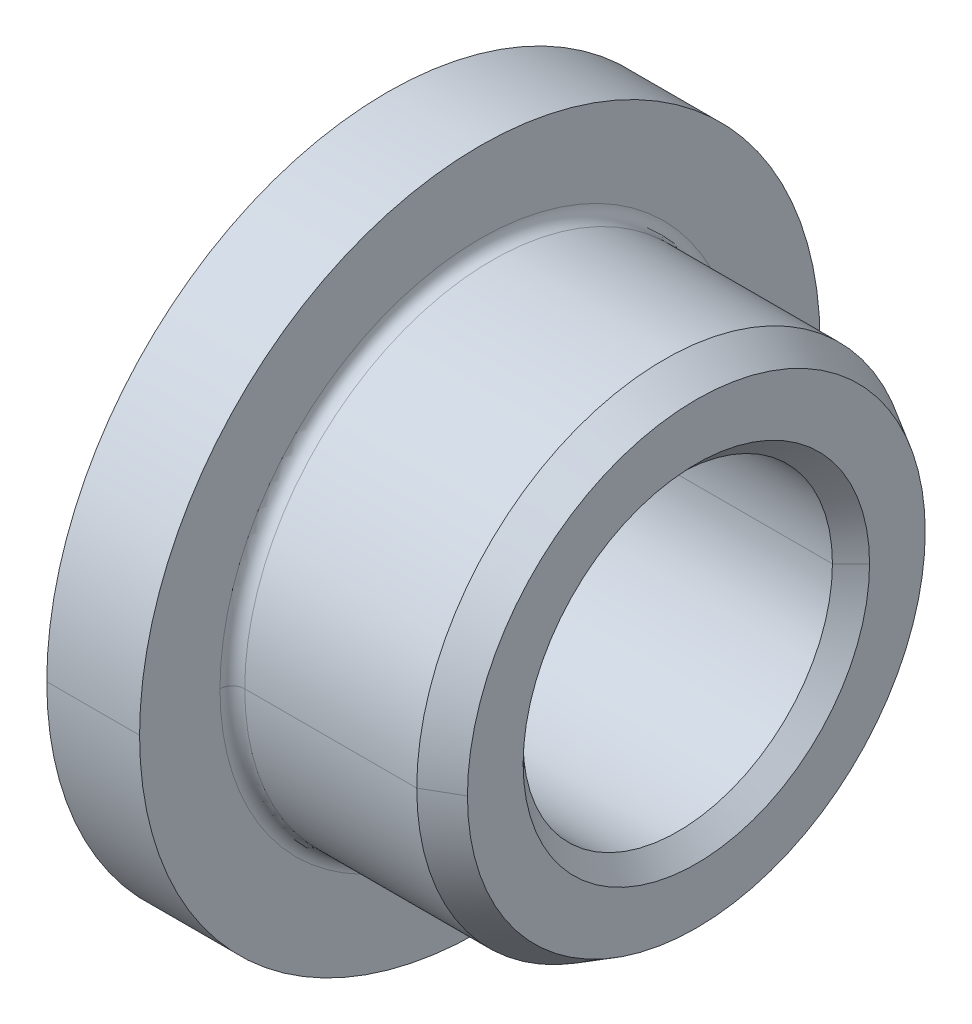
ISO-10303-21;
HEADER;
FILE_DESCRIPTION(('STEP AP214'),'2;1');
FILE_NAME('part.step','',(''),(''),'','','');
FILE_SCHEMA(('AUTOMOTIVE_DESIGN { 1 0 10303 214 1 1 1 1 }'));
ENDSEC;
DATA;
#1=APPLICATION_CONTEXT('core data for automotive mechanical design processes');
#2=APPLICATION_PROTOCOL_DEFINITION('international standard','automotive_design',2000,#1);
#3=PRODUCT_CONTEXT('',#1,'mechanical');
#4=PRODUCT('Part','Part','',(#3));
#5=PRODUCT_RELATED_PRODUCT_CATEGORY('part','',(#4));
#6=PRODUCT_DEFINITION_FORMATION('','',#4);
#7=PRODUCT_DEFINITION_CONTEXT('part definition',#1,'design');
#8=PRODUCT_DEFINITION('design','',#6,#7);
#9=PRODUCT_DEFINITION_SHAPE('','',#8);
#10=(LENGTH_UNIT() NAMED_UNIT(*) SI_UNIT(.MILLI.,.METRE.));
#11=(NAMED_UNIT(*) PLANE_ANGLE_UNIT() SI_UNIT($,.RADIAN.));
#12=(NAMED_UNIT(*) SI_UNIT($,.STERADIAN.) SOLID_ANGLE_UNIT());
#13=UNCERTAINTY_MEASURE_WITH_UNIT(LENGTH_MEASURE(1.E-05),#10,'distance_accuracy_value','');
#14=(GEOMETRIC_REPRESENTATION_CONTEXT(3) GLOBAL_UNCERTAINTY_ASSIGNED_CONTEXT((#13)) GLOBAL_UNIT_ASSIGNED_CONTEXT((#10,
#11,#12)) REPRESENTATION_CONTEXT('',''));
#15=CARTESIAN_POINT('',(0.,0.,0.));
#16=DIRECTION('',(0.,0.,1.));
#17=DIRECTION('',(1.,0.,0.));
#18=AXIS2_PLACEMENT_3D('',#15,#16,#17);
#19=CARTESIAN_POINT('',(50.0000000000018,-4.9960036108132E-13,-2.22044604925031E-13));
#20=DIRECTION('',(-1.00000000000002,0.,0.));
#21=DIRECTION('',(0.,1.,0.));
#22=AXIS2_PLACEMENT_3D('',#19,#20,#21);
#23=CYLINDRICAL_SURFACE('',#22,5.5);
#24=CARTESIAN_POINT('',(0.,0.,0.));
#25=DIRECTION('',(1.00000000000002,0.,0.));
#26=DIRECTION('',(0.,0.,-1.00000000000001));
#27=AXIS2_PLACEMENT_3D('',#24,#25,#26);
#28=CIRCLE('',#27,5.5);
#29=CARTESIAN_POINT('',(-9.71445146547012E-13,0.,5.50000000000044));
#30=VERTEX_POINT('',#29);
#31=CARTESIAN_POINT('',(5.27355936696949E-13,1.11022302462516E-13,-5.500000000001));
#32=VERTEX_POINT('',#31);
#33=EDGE_CURVE('E11',#30,#32,#28,.T.);
#34=ORIENTED_EDGE('',*,*,#33,.T.);
#35=CARTESIAN_POINT('',(1.50000000000091,-4.56085700869188E-13,-5.50000000000012));
#36=DIRECTION('',(-1.,0.,0.));
#37=VECTOR('',#36,1.);
#38=LINE('',#35,#37);
#39=CARTESIAN_POINT('',(1.50000000000053,1.94289029309402E-13,-5.50000000000139));
#40=VERTEX_POINT('',#39);
#41=EDGE_CURVE('E25',#40,#32,#38,.T.);
#42=ORIENTED_EDGE('',*,*,#41,.F.);
#43=CARTESIAN_POINT('',(1.5,0.,0.));
#44=DIRECTION('',(1.00000000000002,0.,0.));
#45=DIRECTION('',(0.,0.,-1.00000000000001));
#46=AXIS2_PLACEMENT_3D('',#43,#44,#45);
#47=CIRCLE('',#46,5.5);
#48=CARTESIAN_POINT('',(1.49999999999903,0.,5.49999999999982));
#49=VERTEX_POINT('',#48);
#50=EDGE_CURVE('E515',#49,#40,#47,.T.);
#51=ORIENTED_EDGE('',*,*,#50,.F.);
#52=CARTESIAN_POINT('',(1.50000000000095,-4.61159509357588E-13,5.50000000000007));
#53=DIRECTION('',(-1.,0.,0.));
#54=VECTOR('',#53,1.);
#55=LINE('',#52,#54);
#56=EDGE_CURVE('E503',#49,#30,#55,.T.);
#57=ORIENTED_EDGE('',*,*,#56,.T.);
#58=EDGE_LOOP('',(#34,#42,#51,#57));
#59=FACE_BOUND('',#58,.T.);
#60=ADVANCED_FACE('F16',(#59),#23,.T.);
#61=CARTESIAN_POINT('',(50.0000000000018,-4.9960036108132E-13,-2.22044604925031E-13));
#62=DIRECTION('',(-1.00000000000002,0.,0.));
#63=DIRECTION('',(0.,-1.,0.));
#64=AXIS2_PLACEMENT_3D('',#61,#62,#63);
#65=CYLINDRICAL_SURFACE('',#64,5.5);
#66=CARTESIAN_POINT('',(1.5,0.,0.));
#67=DIRECTION('',(1.00000000000002,0.,0.));
#68=DIRECTION('',(0.,0.,-1.00000000000001));
#69=AXIS2_PLACEMENT_3D('',#66,#67,#68);
#70=CIRCLE('',#69,5.5);
#71=EDGE_CURVE('E500',#40,#49,#70,.T.);
#72=ORIENTED_EDGE('',*,*,#71,.F.);
#73=ORIENTED_EDGE('',*,*,#41,.T.);
#74=CARTESIAN_POINT('',(0.,0.,0.));
#75=DIRECTION('',(1.00000000000002,0.,0.));
#76=DIRECTION('',(0.,0.,-1.00000000000001));
#77=AXIS2_PLACEMENT_3D('',#74,#75,#76);
#78=CIRCLE('',#77,5.5);
#79=EDGE_CURVE('E467',#32,#30,#78,.T.);
#80=ORIENTED_EDGE('',*,*,#79,.T.);
#81=ORIENTED_EDGE('',*,*,#56,.F.);
#82=EDGE_LOOP('',(#72,#73,#80,#81));
#83=FACE_BOUND('',#82,.T.);
#84=ADVANCED_FACE('F475',(#83),#65,.T.);
#85=CARTESIAN_POINT('',(0.,5.50000000000001,0.));
#86=DIRECTION('',(-1.00000000000002,0.,0.));
#87=DIRECTION('',(0.,0.,1.00000000000001));
#88=AXIS2_PLACEMENT_3D('',#85,#86,#87);
#89=PLANE('',#88);
#90=CARTESIAN_POINT('',(0.,0.,0.));
#91=DIRECTION('',(1.00000000000002,0.,0.));
#92=DIRECTION('',(0.,0.,-1.00000000000001));
#93=AXIS2_PLACEMENT_3D('',#90,#91,#92);
#94=CIRCLE('',#93,2.8);
#95=CARTESIAN_POINT('',(5.27355936696949E-13,0.,-2.8000000000008));
#96=VERTEX_POINT('',#95);
#97=CARTESIAN_POINT('',(-4.44089209850063E-13,-5.27355936696949E-13,2.80000000000097));
#98=VERTEX_POINT('',#97);
#99=EDGE_CURVE('E463',#96,#98,#94,.T.);
#100=ORIENTED_EDGE('',*,*,#99,.T.);
#101=CARTESIAN_POINT('',(0.,0.,0.));
#102=DIRECTION('',(1.00000000000002,0.,0.));
#103=DIRECTION('',(0.,0.,-1.00000000000001));
#104=AXIS2_PLACEMENT_3D('',#101,#102,#103);
#105=CIRCLE('',#104,2.8);
#106=EDGE_CURVE('E461',#98,#96,#105,.T.);
#107=ORIENTED_EDGE('',*,*,#106,.T.);
#108=EDGE_LOOP('',(#100,#107));
#109=FACE_BOUND('',#108,.T.);
#110=ORIENTED_EDGE('',*,*,#79,.F.);
#111=ORIENTED_EDGE('',*,*,#33,.F.);
#112=EDGE_LOOP('',(#110,#111));
#113=FACE_BOUND('',#112,.T.);
#114=ADVANCED_FACE('F483',(#109,#113),#89,.T.);
#115=CARTESIAN_POINT('',(0.,0.,0.));
#116=DIRECTION('',(-1.00000000000002,0.,0.));
#117=DIRECTION('',(0.,1.,0.));
#118=AXIS2_PLACEMENT_3D('',#115,#116,#117);
#119=CONICAL_SURFACE('',#118,2.8,0.785398163397445);
#120=ORIENTED_EDGE('',*,*,#106,.F.);
#121=CARTESIAN_POINT('',(0.300000000000017,0.,2.50000000000004));
#122=DIRECTION('',(-0.707106781186547,0.,0.707106781186548));
#123=VECTOR('',#122,1.);
#124=LINE('',#121,#123);
#125=CARTESIAN_POINT('',(0.299999999999995,-1.11022302462516E-13,2.49999999999989));
#126=VERTEX_POINT('',#125);
#127=EDGE_CURVE('E431',#126,#98,#124,.T.);
#128=ORIENTED_EDGE('',*,*,#127,.F.);
#129=CARTESIAN_POINT('',(0.299999999999995,0.,0.));
#130=DIRECTION('',(1.00000000000002,0.,0.));
#131=DIRECTION('',(0.,0.,-1.00000000000001));
#132=AXIS2_PLACEMENT_3D('',#129,#130,#131);
#133=CIRCLE('',#132,2.5);
#134=CARTESIAN_POINT('',(0.300000000000078,0.,-2.50000000000053));
#135=VERTEX_POINT('',#134);
#136=EDGE_CURVE('E448',#126,#135,#133,.T.);
#137=ORIENTED_EDGE('',*,*,#136,.T.);
#138=CARTESIAN_POINT('',(0.299999999999997,0.,-2.50000000000004));
#139=DIRECTION('',(-0.707106781186553,0.,-0.707106781186542));
#140=VECTOR('',#139,1.);
#141=LINE('',#138,#140);
#142=EDGE_CURVE('E433',#135,#96,#141,.T.);
#143=ORIENTED_EDGE('',*,*,#142,.T.);
#144=EDGE_LOOP('',(#120,#128,#137,#143));
#145=FACE_BOUND('',#144,.T.);
#146=ADVANCED_FACE('F414',(#145),#119,.F.);
#147=CARTESIAN_POINT('',(0.,0.,0.));
#148=DIRECTION('',(-1.00000000000002,0.,0.));
#149=DIRECTION('',(0.,-1.,0.));
#150=AXIS2_PLACEMENT_3D('',#147,#148,#149);
#151=CONICAL_SURFACE('',#150,2.8,0.785398163397445);
#152=CARTESIAN_POINT('',(0.299999999999995,0.,0.));
#153=DIRECTION('',(1.00000000000002,0.,0.));
#154=DIRECTION('',(0.,0.,-1.00000000000001));
#155=AXIS2_PLACEMENT_3D('',#152,#153,#154);
#156=CIRCLE('',#155,2.5);
#157=EDGE_CURVE('E397',#135,#126,#156,.T.);
#158=ORIENTED_EDGE('',*,*,#157,.T.);
#159=ORIENTED_EDGE('',*,*,#127,.T.);
#160=ORIENTED_EDGE('',*,*,#99,.F.);
#161=ORIENTED_EDGE('',*,*,#142,.F.);
#162=EDGE_LOOP('',(#158,#159,#160,#161));
#163=FACE_BOUND('',#162,.T.);
#164=ADVANCED_FACE('F405',(#163),#151,.F.);
#165=CARTESIAN_POINT('',(50.0000000000018,-4.9960036108132E-13,-2.22044604925031E-13));
#166=DIRECTION('',(-1.00000000000002,0.,0.));
#167=DIRECTION('',(0.,-1.,0.));
#168=AXIS2_PLACEMENT_3D('',#165,#166,#167);
#169=CYLINDRICAL_SURFACE('',#168,2.5);
#170=CARTESIAN_POINT('',(4.70000000000001,-1.11022302462516E-13,8.32667268468867E-13));
#171=DIRECTION('',(1.00000000000002,0.,0.));
#172=DIRECTION('',(0.,0.,-1.00000000000001));
#173=AXIS2_PLACEMENT_3D('',#170,#171,#172);
#174=CIRCLE('',#173,2.5);
#175=CARTESIAN_POINT('',(4.70000000000007,0.,-2.49999999999986));
#176=VERTEX_POINT('',#175);
#177=CARTESIAN_POINT('',(4.70000000000001,0.,2.50000000000042));
#178=VERTEX_POINT('',#177);
#179=EDGE_CURVE('E395',#176,#178,#174,.T.);
#180=ORIENTED_EDGE('',*,*,#179,.T.);
#181=CARTESIAN_POINT('',(4.70000000000099,-4.62173268698118E-13,2.50000000000001));
#182=DIRECTION('',(-1.,0.,0.));
#183=VECTOR('',#182,1.);
#184=LINE('',#181,#183);
#185=EDGE_CURVE('E373',#178,#126,#184,.T.);
#186=ORIENTED_EDGE('',*,*,#185,.T.);
#187=ORIENTED_EDGE('',*,*,#157,.F.);
#188=CARTESIAN_POINT('',(4.70000000000098,-4.60479315512056E-13,-2.50000000000008));
#189=DIRECTION('',(-1.,0.,0.));
#190=VECTOR('',#189,1.);
#191=LINE('',#188,#190);
#192=EDGE_CURVE('E385',#176,#135,#191,.T.);
#193=ORIENTED_EDGE('',*,*,#192,.F.);
#194=EDGE_LOOP('',(#180,#186,#187,#193));
#195=FACE_BOUND('',#194,.T.);
#196=ADVANCED_FACE('F352',(#195),#169,.F.);
#197=CARTESIAN_POINT('',(50.0000000000018,-4.9960036108132E-13,-2.22044604925031E-13));
#198=DIRECTION('',(-1.00000000000002,0.,0.));
#199=DIRECTION('',(0.,1.,0.));
#200=AXIS2_PLACEMENT_3D('',#197,#198,#199);
#201=CYLINDRICAL_SURFACE('',#200,2.5);
#202=ORIENTED_EDGE('',*,*,#136,.F.);
#203=ORIENTED_EDGE('',*,*,#185,.F.);
#204=CARTESIAN_POINT('',(4.70000000000001,-1.11022302462516E-13,8.32667268468867E-13));
#205=DIRECTION('',(1.00000000000002,0.,0.));
#206=DIRECTION('',(0.,0.,-1.00000000000001));
#207=AXIS2_PLACEMENT_3D('',#204,#205,#206);
#208=CIRCLE('',#207,2.5);
#209=EDGE_CURVE('E691',#178,#176,#208,.T.);
#210=ORIENTED_EDGE('',*,*,#209,.T.);
#211=ORIENTED_EDGE('',*,*,#192,.T.);
#212=EDGE_LOOP('',(#202,#203,#210,#211));
#213=FACE_BOUND('',#212,.T.);
#214=ADVANCED_FACE('F343',(#213),#201,.F.);
#215=CARTESIAN_POINT('',(4.70000000000001,-1.11022302462516E-13,8.32667268468867E-13));
#216=DIRECTION('',(1.00000000000002,0.,0.));
#217=DIRECTION('',(0.,1.,0.));
#218=AXIS2_PLACEMENT_3D('',#215,#216,#217);
#219=CONICAL_SURFACE('',#218,2.5,0.785398163397457);
#220=ORIENTED_EDGE('',*,*,#209,.F.);
#221=CARTESIAN_POINT('',(4.70000000000002,-1.1156311735576E-13,2.50000000000088));
#222=DIRECTION('',(0.707106781186544,0.,0.707106781186551));
#223=VECTOR('',#222,1.);
#224=LINE('',#221,#223);
#225=CARTESIAN_POINT('',(4.99999999999956,-3.05311331771918E-13,2.79999999999989));
#226=VERTEX_POINT('',#225);
#227=EDGE_CURVE('E308',#178,#226,#224,.T.);
#228=ORIENTED_EDGE('',*,*,#227,.T.);
#229=CARTESIAN_POINT('',(5.,0.,1.16573417585641E-12));
#230=DIRECTION('',(1.00000000000002,0.,0.));
#231=DIRECTION('',(0.,0.,-1.00000000000001));
#232=AXIS2_PLACEMENT_3D('',#229,#230,#231);
#233=CIRCLE('',#232,2.8);
#234=CARTESIAN_POINT('',(5.00000000000053,1.11022302462516E-13,-2.80000000000019));
#235=VERTEX_POINT('',#234);
#236=EDGE_CURVE('E325',#226,#235,#233,.T.);
#237=ORIENTED_EDGE('',*,*,#236,.T.);
#238=CARTESIAN_POINT('',(4.7,-1.10481487569271E-13,-2.49999999999921));
#239=DIRECTION('',(0.707106781186539,0.,-0.707106781186556));
#240=VECTOR('',#239,1.);
#241=LINE('',#238,#240);
#242=EDGE_CURVE('E310',#176,#235,#241,.T.);
#243=ORIENTED_EDGE('',*,*,#242,.F.);
#244=EDGE_LOOP('',(#220,#228,#237,#243));
#245=FACE_BOUND('',#244,.T.);
#246=ADVANCED_FACE('F291',(#245),#219,.F.);
#247=CARTESIAN_POINT('',(4.70000000000001,-1.11022302462516E-13,8.32667268468867E-13));
#248=DIRECTION('',(1.00000000000002,0.,0.));
#249=DIRECTION('',(0.,-1.,0.));
#250=AXIS2_PLACEMENT_3D('',#247,#248,#249);
#251=CONICAL_SURFACE('',#250,2.5,0.785398163397457);
#252=CARTESIAN_POINT('',(5.,0.,1.16573417585641E-12));
#253=DIRECTION('',(1.00000000000002,0.,0.));
#254=DIRECTION('',(0.,0.,-1.00000000000001));
#255=AXIS2_PLACEMENT_3D('',#252,#253,#254);
#256=CIRCLE('',#255,2.8);
#257=EDGE_CURVE('E274',#235,#226,#256,.T.);
#258=ORIENTED_EDGE('',*,*,#257,.T.);
#259=ORIENTED_EDGE('',*,*,#227,.F.);
#260=ORIENTED_EDGE('',*,*,#179,.F.);
#261=ORIENTED_EDGE('',*,*,#242,.T.);
#262=EDGE_LOOP('',(#258,#259,#260,#261));
#263=FACE_BOUND('',#262,.T.);
#264=ADVANCED_FACE('F282',(#263),#251,.F.);
#265=CARTESIAN_POINT('',(5.,2.80000000000039,0.));
#266=DIRECTION('',(1.00000000000002,0.,0.));
#267=DIRECTION('',(0.,0.,-1.00000000000001));
#268=AXIS2_PLACEMENT_3D('',#265,#266,#267);
#269=PLANE('',#268);
#270=CARTESIAN_POINT('',(5.,0.,1.16573417585641E-12));
#271=DIRECTION('',(1.00000000000002,0.,0.));
#272=DIRECTION('',(0.,0.,-1.00000000000001));
#273=AXIS2_PLACEMENT_3D('',#270,#271,#272);
#274=CIRCLE('',#273,3.7);
#275=CARTESIAN_POINT('',(5.00000000000053,0.,-3.70000000000031));
#276=VERTEX_POINT('',#275);
#277=CARTESIAN_POINT('',(4.99999999999956,2.4980018054066E-13,3.69999999999954));
#278=VERTEX_POINT('',#277);
#279=EDGE_CURVE('E270',#276,#278,#274,.T.);
#280=ORIENTED_EDGE('',*,*,#279,.T.);
#281=CARTESIAN_POINT('',(5.,0.,1.16573417585641E-12));
#282=DIRECTION('',(1.00000000000002,0.,0.));
#283=DIRECTION('',(0.,0.,-1.00000000000001));
#284=AXIS2_PLACEMENT_3D('',#281,#282,#283);
#285=CIRCLE('',#284,3.7);
#286=EDGE_CURVE('E266',#278,#276,#285,.T.);
#287=ORIENTED_EDGE('',*,*,#286,.T.);
#288=EDGE_LOOP('',(#280,#287));
#289=FACE_BOUND('',#288,.T.);
#290=ORIENTED_EDGE('',*,*,#257,.F.);
#291=ORIENTED_EDGE('',*,*,#236,.F.);
#292=EDGE_LOOP('',(#290,#291));
#293=FACE_BOUND('',#292,.T.);
#294=ADVANCED_FACE('F250',(#289,#293),#269,.T.);
#295=CARTESIAN_POINT('',(5.,0.,1.16573417585641E-12));
#296=DIRECTION('',(-1.00000000000002,0.,0.));
#297=DIRECTION('',(0.,1.,0.));
#298=AXIS2_PLACEMENT_3D('',#295,#296,#297);
#299=CONICAL_SURFACE('',#298,3.7,0.52359877559827);
#300=CARTESIAN_POINT('',(4.4803847577293,-1.11022302462516E-13,8.32667268468867E-13));
#301=DIRECTION('',(1.00000000000002,0.,0.));
#302=DIRECTION('',(0.,0.,-1.00000000000001));
#303=AXIS2_PLACEMENT_3D('',#300,#301,#302);
#304=CIRCLE('',#303,4.);
#305=CARTESIAN_POINT('',(4.48038475772886,0.,3.99999999999967));
#306=VERTEX_POINT('',#305);
#307=CARTESIAN_POINT('',(4.48038475772983,1.11022302462516E-13,-4.00000000000056));
#308=VERTEX_POINT('',#307);
#309=EDGE_CURVE('E264',#306,#308,#304,.T.);
#310=ORIENTED_EDGE('',*,*,#309,.T.);
#311=CARTESIAN_POINT('',(4.99999999999999,0.,-3.6999999999989));
#312=DIRECTION('',(-0.866025403784455,0.,-0.499999999999971));
#313=VECTOR('',#312,1.);
#314=LINE('',#311,#313);
#315=EDGE_CURVE('E236',#276,#308,#314,.T.);
#316=ORIENTED_EDGE('',*,*,#315,.F.);
#317=ORIENTED_EDGE('',*,*,#286,.F.);
#318=CARTESIAN_POINT('',(5.00000000000002,0.,3.70000000000123));
#319=DIRECTION('',(-0.866025403784451,0.,0.499999999999978));
#320=VECTOR('',#319,1.);
#321=LINE('',#318,#320);
#322=EDGE_CURVE('E220',#278,#306,#321,.T.);
#323=ORIENTED_EDGE('',*,*,#322,.T.);
#324=EDGE_LOOP('',(#310,#316,#317,#323));
#325=FACE_BOUND('',#324,.T.);
#326=ADVANCED_FACE('F241',(#325),#299,.T.);
#327=CARTESIAN_POINT('',(5.,0.,1.16573417585641E-12));
#328=DIRECTION('',(-1.00000000000002,0.,0.));
#329=DIRECTION('',(0.,-1.,0.));
#330=AXIS2_PLACEMENT_3D('',#327,#328,#329);
#331=CONICAL_SURFACE('',#330,3.7,0.52359877559827);
#332=ORIENTED_EDGE('',*,*,#279,.F.);
#333=ORIENTED_EDGE('',*,*,#315,.T.);
#334=CARTESIAN_POINT('',(4.4803847577293,-1.11022302462516E-13,8.32667268468867E-13));
#335=DIRECTION('',(1.00000000000002,0.,0.));
#336=DIRECTION('',(0.,0.,-1.00000000000001));
#337=AXIS2_PLACEMENT_3D('',#334,#335,#336);
#338=CIRCLE('',#337,4.);
#339=EDGE_CURVE('E221',#308,#306,#338,.T.);
#340=ORIENTED_EDGE('',*,*,#339,.T.);
#341=ORIENTED_EDGE('',*,*,#322,.F.);
#342=EDGE_LOOP('',(#332,#333,#340,#341));
#343=FACE_BOUND('',#342,.T.);
#344=ADVANCED_FACE('F189',(#343),#331,.T.);
#345=CARTESIAN_POINT('',(50.0000000000018,-4.9960036108132E-13,-2.22044604925031E-13));
#346=DIRECTION('',(-1.00000000000002,0.,0.));
#347=DIRECTION('',(0.,-1.,0.));
#348=AXIS2_PLACEMENT_3D('',#345,#346,#347);
#349=CYLINDRICAL_SURFACE('',#348,4.);
#350=ORIENTED_EDGE('',*,*,#339,.F.);
#351=CARTESIAN_POINT('',(4.48038475773026,-4.59295717438545E-13,-4.00000000000011));
#352=DIRECTION('',(-1.,0.,0.));
#353=VECTOR('',#352,1.);
#354=LINE('',#351,#353);
#355=CARTESIAN_POINT('',(1.70000000000051,1.94289029309402E-13,-4.00000000000145));
#356=VERTEX_POINT('',#355);
#357=EDGE_CURVE('E171',#308,#356,#354,.T.);
#358=ORIENTED_EDGE('',*,*,#357,.T.);
#359=CARTESIAN_POINT('',(1.70000000000001,0.,0.));
#360=DIRECTION('',(1.00000000000002,0.,0.));
#361=DIRECTION('',(0.,0.,-1.00000000000001));
#362=AXIS2_PLACEMENT_3D('',#359,#360,#361);
#363=CIRCLE('',#362,4.);
#364=CARTESIAN_POINT('',(1.69999999999956,1.11022302462516E-13,3.99999999999931));
#365=VERTEX_POINT('',#364);
#366=EDGE_CURVE('E108',#356,#365,#363,.T.);
#367=ORIENTED_EDGE('',*,*,#366,.T.);
#368=CARTESIAN_POINT('',(4.48038475773029,-4.62985759975563E-13,4.00000000000003));
#369=DIRECTION('',(-1.,0.,0.));
#370=VECTOR('',#369,1.);
#371=LINE('',#368,#370);
#372=EDGE_CURVE('E160',#306,#365,#371,.T.);
#373=ORIENTED_EDGE('',*,*,#372,.F.);
#374=EDGE_LOOP('',(#350,#358,#367,#373));
#375=FACE_BOUND('',#374,.T.);
#376=ADVANCED_FACE('F180',(#375),#349,.T.);
#377=CARTESIAN_POINT('',(50.0000000000018,-4.9960036108132E-13,-2.22044604925031E-13));
#378=DIRECTION('',(-1.00000000000002,0.,0.));
#379=DIRECTION('',(0.,1.,0.));
#380=AXIS2_PLACEMENT_3D('',#377,#378,#379);
#381=CYLINDRICAL_SURFACE('',#380,4.);
#382=CARTESIAN_POINT('',(1.70000000000001,0.,0.));
#383=DIRECTION('',(1.00000000000002,0.,0.));
#384=DIRECTION('',(0.,0.,-1.00000000000001));
#385=AXIS2_PLACEMENT_3D('',#382,#383,#384);
#386=CIRCLE('',#385,4.);
#387=EDGE_CURVE('E172',#365,#356,#386,.T.);
#388=ORIENTED_EDGE('',*,*,#387,.T.);
#389=ORIENTED_EDGE('',*,*,#357,.F.);
#390=ORIENTED_EDGE('',*,*,#309,.F.);
#391=ORIENTED_EDGE('',*,*,#372,.T.);
#392=EDGE_LOOP('',(#388,#389,#390,#391));
#393=FACE_BOUND('',#392,.T.);
#394=ADVANCED_FACE('F129',(#393),#381,.T.);
#395=CARTESIAN_POINT('',(1.70000000000003,0.,0.));
#396=DIRECTION('',(1.00000000000002,0.,0.));
#397=DIRECTION('',(0.,1.,0.));
#398=AXIS2_PLACEMENT_3D('',#395,#396,#397);
#399=TOROIDAL_SURFACE('',#398,4.20000000000003,0.200000000000032);
#400=ORIENTED_EDGE('',*,*,#387,.F.);
#401=CARTESIAN_POINT('',(1.70000000000002,0.,4.00000000000007));
#402=CARTESIAN_POINT('',(1.6967275043168,0.,3.99999993058231));
#403=CARTESIAN_POINT('',(1.69345501454035,0.,4.00008031657656));
#404=CARTESIAN_POINT('',(1.68691791554269,0.,4.00040150095065));
#405=CARTESIAN_POINT('',(1.68365330632148,0.,4.00064229933048));
#406=CARTESIAN_POINT('',(1.677139837176,0.,4.0012838100373));
#407=CARTESIAN_POINT('',(1.67389097725174,0.,4.00168452236428));
#408=CARTESIAN_POINT('',(1.66741683241341,0.,4.00264487373195));
#409=CARTESIAN_POINT('',(1.66419154749935,0.,4.00320451277263));
#410=CARTESIAN_POINT('',(1.65777232296349,0.,4.00448137521157));
#411=CARTESIAN_POINT('',(1.65457838334169,0.,4.00519859860983));
#412=CARTESIAN_POINT('',(1.64822954379363,0.,4.0067889003388));
#413=CARTESIAN_POINT('',(1.64507464386736,0.,4.00766197866951));
#414=CARTESIAN_POINT('',(1.63881148416143,0.,4.00956188736217));
#415=CARTESIAN_POINT('',(1.63570322438178,0.,4.01058871772411));
#416=CARTESIAN_POINT('',(1.62954083303374,0.,4.01279365664209));
#417=CARTESIAN_POINT('',(1.62648670146536,0.,4.01397176519812));
#418=CARTESIAN_POINT('',(1.62043992421195,0.,4.01647642236776));
#419=CARTESIAN_POINT('',(1.61744727852693,0.,4.01780297098136));
#420=CARTESIAN_POINT('',(1.61153068258556,0.,4.02060131248617));
#421=CARTESIAN_POINT('',(1.60860673232922,0.,4.02207310537737));
#422=CARTESIAN_POINT('',(1.60283457129771,0.,4.02515838976149));
#423=CARTESIAN_POINT('',(1.59998636052256,0.,4.02677188125442));
#424=CARTESIAN_POINT('',(1.59437254004278,0.,4.03013667579899));
#425=CARTESIAN_POINT('',(1.59160693033815,0.,4.03188797885064));
#426=CARTESIAN_POINT('',(1.58616497459557,0.,4.03552417747031));
#427=CARTESIAN_POINT('',(1.58348862855761,0.,4.03740907303831));
#428=CARTESIAN_POINT('',(1.57823164770053,0.,4.04130791581205));
#429=CARTESIAN_POINT('',(1.5756510128814,0.,4.04332186301777));
#430=CARTESIAN_POINT('',(1.57059167143739,0.,4.04747395729162));
#431=CARTESIAN_POINT('',(1.56811296481252,0.,4.04961210435975));
#432=CARTESIAN_POINT('',(1.56326345117851,0.,4.05400744737475));
#433=CARTESIAN_POINT('',(1.56089264416938,0.,4.05626464332163));
#434=CARTESIAN_POINT('',(1.5562646412487,0.,4.06089264631127));
#435=CARTESIAN_POINT('',(1.55400744533715,0.,4.06326345335404));
#436=CARTESIAN_POINT('',(1.54961210239441,0.,4.06811296705355));
#437=CARTESIAN_POINT('',(1.54747395536322,0.,4.07059167371028));
#438=CARTESIAN_POINT('',(1.54332186116475,0.,4.07565101521616));
#439=CARTESIAN_POINT('',(1.54130791399749,0.,4.0782316500653));
#440=CARTESIAN_POINT('',(1.53740907130209,0.,4.08348863098048));
#441=CARTESIAN_POINT('',(1.53552417577396,0.,4.08616497704652));
#442=CARTESIAN_POINT('',(1.53188797723539,0.,4.09160693284329));
#443=CARTESIAN_POINT('',(1.53013667422495,0.,4.09437254257401));
#444=CARTESIAN_POINT('',(1.52677187976403,0.,4.09998636310394));
#445=CARTESIAN_POINT('',(1.52515838831355,0.,4.10283457390313));
#446=CARTESIAN_POINT('',(1.52207310401544,0.,4.10860673498061));
#447=CARTESIAN_POINT('',(1.52060131116781,0.,4.11153068525889));
#448=CARTESIAN_POINT('',(1.51780296975117,0.,4.11744728124195));
#449=CARTESIAN_POINT('',(1.51647642118216,0.,4.12043992694674));
#450=CARTESIAN_POINT('',(1.51397176410263,0.,4.12648670423747));
#451=CARTESIAN_POINT('',(1.5127936555921,0.,4.12954083582341));
#452=CARTESIAN_POINT('',(1.51058871676596,0.,4.1357032272043));
#453=CARTESIAN_POINT('',(1.50956188645033,0.,4.13881148699926));
#454=CARTESIAN_POINT('',(1.507661977851,0.,4.14507464673349));
#455=CARTESIAN_POINT('',(1.5067888995673,0.,4.14822954667277));
#456=CARTESIAN_POINT('',(1.50519859793293,0.,4.15457838624454));
#457=CARTESIAN_POINT('',(1.50448137458228,0.,4.15777232587703));
#458=CARTESIAN_POINT('',(1.50320451223899,0.,4.16419155043191));
#459=CARTESIAN_POINT('',(1.50264487324636,0.,4.16741683535431));
#460=CARTESIAN_POINT('',(1.50168452197517,0.,4.17389098020695));
#461=CARTESIAN_POINT('',(1.5012838096966,0.,4.17713984013718));
#462=CARTESIAN_POINT('',(1.50064229908684,0.,4.18365330929222));
#463=CARTESIAN_POINT('',(1.50040150075566,0.,4.18691791851702));
#464=CARTESIAN_POINT('',(1.50008031647898,0.,4.19345501751946));
#465=CARTESIAN_POINT('',(1.4999999305335,0.,4.19672750729711));
#466=CARTESIAN_POINT('',(1.50000000000002,0.,4.20000000298033));
#467=B_SPLINE_CURVE_WITH_KNOTS('',3,(#401,#402,#403,#404,#405,#406,#407,#408,#409,#410,#411,
#412,#413,#414,#415,#416,#417,#418,#419,#420,#421,#422,#423,#424,#425,#426,#427,#428,#429,#430,
#431,#432,#433,#434,#435,#436,#437,#438,#439,#440,#441,#442,#443,#444,#445,#446,#447,#448,#449,
#450,#451,#452,#453,#454,#455,#456,#457,#458,#459,#460,#461,#462,#463,#464,#465,#466),
.UNSPECIFIED.,.F.,.F.,(4,2,2,2,2,2,2,2,2,2,2,2,2,2,2,2,2,2,2,2,2,2,2,2,2,2,2,2,2,2,2,2,4),(0.,
0.00981649150226983,0.0196329830045397,0.0294494745068094,0.0392659660090793,0.0490824575113492,
0.058898949013619,0.0687154405158888,0.0785319320181586,0.0883484235204285,0.0981649150226984,
0.107981406524968,0.117797898027239,0.127614389529508,0.137430881031778,0.147247372534048,
0.157063864036318,0.166880355538588,0.176696847040857,0.186513338543127,0.196329830045397,
0.206146321547667,0.215962813049937,0.225779304552206,0.235595796054476,0.245412287556747,
0.255228779059017,0.265045270561286,0.274861762063555,0.284678253565825,0.294494745068095,
0.304311236570366,0.314127728072635),.UNSPECIFIED.);
#468=CARTESIAN_POINT('',(1.49999999999956,2.4980018054066E-13,4.20000000297968));
#469=VERTEX_POINT('',#468);
#470=EDGE_CURVE('E98',#365,#469,#467,.T.);
#471=ORIENTED_EDGE('',*,*,#470,.T.);
#472=CARTESIAN_POINT('',(1.5,0.,0.));
#473=DIRECTION('',(1.00000000000002,0.,0.));
#474=DIRECTION('',(0.,0.,-1.00000000000001));
#475=AXIS2_PLACEMENT_3D('',#472,#473,#474);
#476=CIRCLE('',#475,4.20000000298026);
#477=CARTESIAN_POINT('',(1.50000000000053,1.66533453693773E-13,-4.20000000298154));
#478=VERTEX_POINT('',#477);
#479=EDGE_CURVE('E90',#469,#478,#476,.T.);
#480=ORIENTED_EDGE('',*,*,#479,.T.);
#481=CARTESIAN_POINT('',(1.69999999999999,0.,-4.00000000000007));
#482=CARTESIAN_POINT('',(1.69672750431677,0.,-3.99999993058231));
#483=CARTESIAN_POINT('',(1.69345501454031,0.,-4.00008031657656));
#484=CARTESIAN_POINT('',(1.68691791554265,0.,-4.00040150095065));
#485=CARTESIAN_POINT('',(1.68365330632145,0.,-4.00064229933048));
#486=CARTESIAN_POINT('',(1.67713983717597,0.,-4.0012838100373));
#487=CARTESIAN_POINT('',(1.6738909772517,0.,-4.00168452236428));
#488=CARTESIAN_POINT('',(1.66741683241338,0.,-4.00264487373195));
#489=CARTESIAN_POINT('',(1.66419154749932,0.,-4.00320451277263));
#490=CARTESIAN_POINT('',(1.65777232296346,0.,-4.00448137521157));
#491=CARTESIAN_POINT('',(1.65457838334166,0.,-4.00519859860983));
#492=CARTESIAN_POINT('',(1.64822954379359,0.,-4.0067889003388));
#493=CARTESIAN_POINT('',(1.64507464386732,0.,-4.00766197866951));
#494=CARTESIAN_POINT('',(1.6388114841614,0.,-4.00956188736217));
#495=CARTESIAN_POINT('',(1.63570322438174,0.,-4.01058871772411));
#496=CARTESIAN_POINT('',(1.62954083303371,0.,-4.01279365664209));
#497=CARTESIAN_POINT('',(1.62648670146533,0.,-4.01397176519812));
#498=CARTESIAN_POINT('',(1.62043992421192,0.,-4.01647642236776));
#499=CARTESIAN_POINT('',(1.6174472785269,0.,-4.01780297098136));
#500=CARTESIAN_POINT('',(1.61153068258553,0.,-4.02060131248617));
#501=CARTESIAN_POINT('',(1.60860673232918,0.,-4.02207310537737));
#502=CARTESIAN_POINT('',(1.60283457129768,0.,-4.02515838976149));
#503=CARTESIAN_POINT('',(1.59998636052253,0.,-4.02677188125442));
#504=CARTESIAN_POINT('',(1.59437254004274,0.,-4.03013667579899));
#505=CARTESIAN_POINT('',(1.59160693033812,0.,-4.03188797885064));
#506=CARTESIAN_POINT('',(1.58616497459553,0.,-4.0355241774703));
#507=CARTESIAN_POINT('',(1.58348862855758,0.,-4.03740907303831));
#508=CARTESIAN_POINT('',(1.5782316477005,0.,-4.04130791581205));
#509=CARTESIAN_POINT('',(1.57565101288137,0.,-4.04332186301777));
#510=CARTESIAN_POINT('',(1.57059167143736,0.,-4.04747395729162));
#511=CARTESIAN_POINT('',(1.56811296481249,0.,-4.04961210435975));
#512=CARTESIAN_POINT('',(1.56326345117848,0.,-4.05400744737475));
#513=CARTESIAN_POINT('',(1.56089264416934,0.,-4.05626464332163));
#514=CARTESIAN_POINT('',(1.55626464124866,0.,-4.06089264631127));
#515=CARTESIAN_POINT('',(1.55400744533712,0.,-4.06326345335404));
#516=CARTESIAN_POINT('',(1.54961210239438,0.,-4.06811296705354));
#517=CARTESIAN_POINT('',(1.54747395536318,0.,-4.07059167371028));
#518=CARTESIAN_POINT('',(1.54332186116472,0.,-4.07565101521616));
#519=CARTESIAN_POINT('',(1.54130791399745,0.,-4.0782316500653));
#520=CARTESIAN_POINT('',(1.53740907130206,0.,-4.08348863098048));
#521=CARTESIAN_POINT('',(1.53552417577393,0.,-4.08616497704652));
#522=CARTESIAN_POINT('',(1.53188797723536,0.,-4.09160693284329));
#523=CARTESIAN_POINT('',(1.53013667422492,0.,-4.09437254257401));
#524=CARTESIAN_POINT('',(1.526771879764,0.,-4.09998636310393));
#525=CARTESIAN_POINT('',(1.52515838831352,0.,-4.10283457390313));
#526=CARTESIAN_POINT('',(1.52207310401541,0.,-4.10860673498061));
#527=CARTESIAN_POINT('',(1.52060131116777,0.,-4.11153068525888));
#528=CARTESIAN_POINT('',(1.51780296975113,0.,-4.11744728124195));
#529=CARTESIAN_POINT('',(1.51647642118213,0.,-4.12043992694674));
#530=CARTESIAN_POINT('',(1.5139717641026,0.,-4.12648670423747));
#531=CARTESIAN_POINT('',(1.51279365559207,0.,-4.12954083582341));
#532=CARTESIAN_POINT('',(1.51058871676592,0.,-4.1357032272043));
#533=CARTESIAN_POINT('',(1.5095618864503,0.,-4.13881148699926));
#534=CARTESIAN_POINT('',(1.50766197785097,0.,-4.14507464673349));
#535=CARTESIAN_POINT('',(1.50678889956727,0.,-4.14822954667277));
#536=CARTESIAN_POINT('',(1.5051985979329,0.,-4.15457838624454));
#537=CARTESIAN_POINT('',(1.50448137458224,0.,-4.15777232587702));
#538=CARTESIAN_POINT('',(1.50320451223896,0.,-4.16419155043191));
#539=CARTESIAN_POINT('',(1.50264487324633,0.,-4.16741683535431));
#540=CARTESIAN_POINT('',(1.50168452197513,0.,-4.17389098020695));
#541=CARTESIAN_POINT('',(1.50128380969656,0.,-4.17713984013718));
#542=CARTESIAN_POINT('',(1.50064229908681,0.,-4.18365330929222));
#543=CARTESIAN_POINT('',(1.50040150075562,0.,-4.18691791851701));
#544=CARTESIAN_POINT('',(1.50008031647895,0.,-4.19345501751946));
#545=CARTESIAN_POINT('',(1.49999993053346,0.,-4.19672750729711));
#546=CARTESIAN_POINT('',(1.49999999999998,0.,-4.20000000298033));
#547=B_SPLINE_CURVE_WITH_KNOTS('',3,(#481,#482,#483,#484,#485,#486,#487,#488,#489,#490,#491,
#492,#493,#494,#495,#496,#497,#498,#499,#500,#501,#502,#503,#504,#505,#506,#507,#508,#509,#510,
#511,#512,#513,#514,#515,#516,#517,#518,#519,#520,#521,#522,#523,#524,#525,#526,#527,#528,#529,
#530,#531,#532,#533,#534,#535,#536,#537,#538,#539,#540,#541,#542,#543,#544,#545,#546),
.UNSPECIFIED.,.F.,.F.,(4,2,2,2,2,2,2,2,2,2,2,2,2,2,2,2,2,2,2,2,2,2,2,2,2,2,2,2,2,2,2,2,4),(0.,
0.00981649150226983,0.0196329830045397,0.0294494745068096,0.0392659660090793,0.0490824575113492,
0.058898949013619,0.0687154405158888,0.0785319320181586,0.0883484235204285,0.0981649150226984,
0.107981406524968,0.117797898027238,0.127614389529508,0.137430881031778,0.147247372534047,
0.157063864036317,0.166880355538587,0.176696847040856,0.186513338543126,0.196329830045397,
0.206146321547666,0.215962813049936,0.225779304552206,0.235595796054476,0.245412287556746,
0.255228779059016,0.265045270561286,0.274861762063556,0.284678253565825,0.294494745068095,
0.304311236570365,0.314127728072635),.UNSPECIFIED.);
#548=EDGE_CURVE('E94',#356,#478,#547,.T.);
#549=ORIENTED_EDGE('',*,*,#548,.F.);
#550=EDGE_LOOP('',(#400,#471,#480,#549));
#551=FACE_BOUND('',#550,.T.);
#552=ADVANCED_FACE('F93',(#551),#399,.F.);
#553=CARTESIAN_POINT('',(1.70000000000003,0.,0.));
#554=DIRECTION('',(1.00000000000002,0.,0.));
#555=DIRECTION('',(0.,-1.,0.));
#556=AXIS2_PLACEMENT_3D('',#553,#554,#555);
#557=TOROIDAL_SURFACE('',#556,4.20000000000003,0.200000000000032);
#558=CARTESIAN_POINT('',(1.5,0.,0.));
#559=DIRECTION('',(1.00000000000002,0.,0.));
#560=DIRECTION('',(0.,0.,-1.00000000000001));
#561=AXIS2_PLACEMENT_3D('',#558,#559,#560);
#562=CIRCLE('',#561,4.20000000298026);
#563=EDGE_CURVE('E107',#478,#469,#562,.T.);
#564=ORIENTED_EDGE('',*,*,#563,.T.);
#565=ORIENTED_EDGE('',*,*,#470,.F.);
#566=ORIENTED_EDGE('',*,*,#366,.F.);
#567=ORIENTED_EDGE('',*,*,#548,.T.);
#568=EDGE_LOOP('',(#564,#565,#566,#567));
#569=FACE_BOUND('',#568,.T.);
#570=ADVANCED_FACE('F106',(#569),#557,.F.);
#571=CARTESIAN_POINT('',(1.5,4.20000000000034,1.11022302462516E-13));
#572=DIRECTION('',(1.00000000000002,0.,0.));
#573=DIRECTION('',(0.,0.,-1.00000000000001));
#574=AXIS2_PLACEMENT_3D('',#571,#572,#573);
#575=PLANE('',#574);
#576=ORIENTED_EDGE('',*,*,#71,.T.);
#577=ORIENTED_EDGE('',*,*,#50,.T.);
#578=EDGE_LOOP('',(#576,#577));
#579=FACE_BOUND('',#578,.T.);
#580=ORIENTED_EDGE('',*,*,#563,.F.);
#581=ORIENTED_EDGE('',*,*,#479,.F.);
#582=EDGE_LOOP('',(#580,#581));
#583=FACE_BOUND('',#582,.T.);
#584=ADVANCED_FACE('F111',(#579,#583),#575,.T.);
#585=CLOSED_SHELL('',(#60,#84,#114,#146,#164,#196,#214,#246,#264,#294,#326,#344,#376,#394,#552,
#570,#584));
#586=MANIFOLD_SOLID_BREP('B1',#585);
#587=ADVANCED_BREP_SHAPE_REPRESENTATION('',(#18,#586),#14);
#588=SHAPE_DEFINITION_REPRESENTATION(#9,#587);
ENDSEC;
END-ISO-10303-21;
